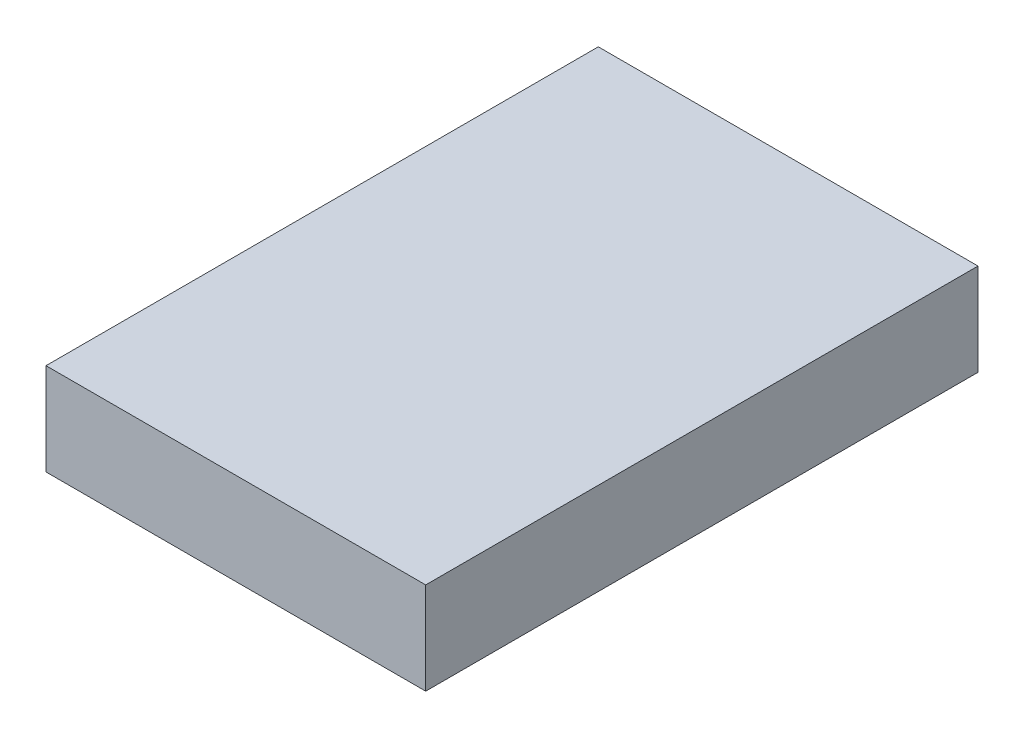
ISO-10303-21;
HEADER;
FILE_DESCRIPTION(('STEP AP214'),'2;1');
FILE_NAME('part.step','',(''),(''),'','','');
FILE_SCHEMA(('AUTOMOTIVE_DESIGN { 1 0 10303 214 1 1 1 1 }'));
ENDSEC;
DATA;
#1=APPLICATION_CONTEXT('core data for automotive mechanical design processes');
#2=APPLICATION_PROTOCOL_DEFINITION('international standard','automotive_design',2000,#1);
#3=PRODUCT_CONTEXT('',#1,'mechanical');
#4=PRODUCT('Part','Part','',(#3));
#5=PRODUCT_RELATED_PRODUCT_CATEGORY('part','',(#4));
#6=PRODUCT_DEFINITION_FORMATION('','',#4);
#7=PRODUCT_DEFINITION_CONTEXT('part definition',#1,'design');
#8=PRODUCT_DEFINITION('design','',#6,#7);
#9=PRODUCT_DEFINITION_SHAPE('','',#8);
#10=(LENGTH_UNIT() NAMED_UNIT(*) SI_UNIT(.MILLI.,.METRE.));
#11=(NAMED_UNIT(*) PLANE_ANGLE_UNIT() SI_UNIT($,.RADIAN.));
#12=(NAMED_UNIT(*) SI_UNIT($,.STERADIAN.) SOLID_ANGLE_UNIT());
#13=UNCERTAINTY_MEASURE_WITH_UNIT(LENGTH_MEASURE(1.E-05),#10,'distance_accuracy_value','');
#14=(GEOMETRIC_REPRESENTATION_CONTEXT(3) GLOBAL_UNCERTAINTY_ASSIGNED_CONTEXT((#13)) GLOBAL_UNIT_ASSIGNED_CONTEXT((#10,
#11,#12)) REPRESENTATION_CONTEXT('',''));
#15=CARTESIAN_POINT('',(0.,0.,0.));
#16=DIRECTION('',(0.,0.,1.));
#17=DIRECTION('',(1.,0.,0.));
#18=AXIS2_PLACEMENT_3D('',#15,#16,#17);
#19=CARTESIAN_POINT('',(8.24999999999999,4.,-12.));
#20=DIRECTION('',(-1.,0.,0.));
#21=DIRECTION('',(0.,0.,1.));
#22=AXIS2_PLACEMENT_3D('',#19,#20,#21);
#23=PLANE('',#22);
#24=DIRECTION('',(0.,0.,-1.));
#25=VECTOR('',#24,1.);
#26=CARTESIAN_POINT('',(8.24999999999999,0.,-12.));
#27=LINE('',#26,#25);
#28=CARTESIAN_POINT('',(8.25,0.,12.));
#29=VERTEX_POINT('',#28);
#30=CARTESIAN_POINT('',(8.24999999999999,0.,-12.));
#31=VERTEX_POINT('',#30);
#32=EDGE_CURVE('E97',#29,#31,#27,.T.);
#33=ORIENTED_EDGE('',*,*,#32,.T.);
#34=DIRECTION('',(0.,-1.,0.));
#35=VECTOR('',#34,1.);
#36=CARTESIAN_POINT('',(8.24999999999999,4.,-12.));
#37=LINE('',#36,#35);
#38=CARTESIAN_POINT('',(8.24999999999999,4.,-12.));
#39=VERTEX_POINT('',#38);
#40=EDGE_CURVE('E11',#39,#31,#37,.T.);
#41=ORIENTED_EDGE('',*,*,#40,.F.);
#42=DIRECTION('',(0.,0.,-1.));
#43=VECTOR('',#42,1.);
#44=CARTESIAN_POINT('',(8.24999999999999,4.,-12.));
#45=LINE('',#44,#43);
#46=CARTESIAN_POINT('',(8.25,4.,12.));
#47=VERTEX_POINT('',#46);
#48=EDGE_CURVE('E85',#47,#39,#45,.T.);
#49=ORIENTED_EDGE('',*,*,#48,.F.);
#50=DIRECTION('',(0.,-1.,0.));
#51=VECTOR('',#50,1.);
#52=CARTESIAN_POINT('',(8.25,4.,12.));
#53=LINE('',#52,#51);
#54=EDGE_CURVE('E93',#47,#29,#53,.T.);
#55=ORIENTED_EDGE('',*,*,#54,.T.);
#56=EDGE_LOOP('',(#33,#41,#49,#55));
#57=FACE_BOUND('',#56,.T.);
#58=ADVANCED_FACE('F34',(#57),#23,.F.);
#59=CARTESIAN_POINT('',(-8.25000000000001,4.,-12.));
#60=DIRECTION('',(0.,0.,1.));
#61=DIRECTION('',(1.,0.,0.));
#62=AXIS2_PLACEMENT_3D('',#59,#60,#61);
#63=PLANE('',#62);
#64=DIRECTION('',(-1.,0.,0.));
#65=VECTOR('',#64,1.);
#66=CARTESIAN_POINT('',(-8.25000000000001,0.,-12.));
#67=LINE('',#66,#65);
#68=CARTESIAN_POINT('',(-8.25000000000001,0.,-12.));
#69=VERTEX_POINT('',#68);
#70=EDGE_CURVE('E89',#31,#69,#67,.T.);
#71=ORIENTED_EDGE('',*,*,#70,.T.);
#72=DIRECTION('',(0.,-1.,0.));
#73=VECTOR('',#72,1.);
#74=CARTESIAN_POINT('',(-8.25000000000001,4.,-12.));
#75=LINE('',#74,#73);
#76=CARTESIAN_POINT('',(-8.25000000000001,4.,-12.));
#77=VERTEX_POINT('',#76);
#78=EDGE_CURVE('E42',#77,#69,#75,.T.);
#79=ORIENTED_EDGE('',*,*,#78,.F.);
#80=DIRECTION('',(-1.,0.,0.));
#81=VECTOR('',#80,1.);
#82=CARTESIAN_POINT('',(-8.25000000000001,4.,-12.));
#83=LINE('',#82,#81);
#84=EDGE_CURVE('E80',#39,#77,#83,.T.);
#85=ORIENTED_EDGE('',*,*,#84,.F.);
#86=ORIENTED_EDGE('',*,*,#40,.T.);
#87=EDGE_LOOP('',(#71,#79,#85,#86));
#88=FACE_BOUND('',#87,.T.);
#89=ADVANCED_FACE('F88',(#88),#63,.F.);
#90=CARTESIAN_POINT('',(-8.25000000000001,4.,-12.));
#91=DIRECTION('',(1.,0.,0.));
#92=DIRECTION('',(0.,0.,-1.));
#93=AXIS2_PLACEMENT_3D('',#90,#91,#92);
#94=PLANE('',#93);
#95=DIRECTION('',(0.,0.,1.));
#96=VECTOR('',#95,1.);
#97=CARTESIAN_POINT('',(-8.25000000000001,0.,-12.));
#98=LINE('',#97,#96);
#99=CARTESIAN_POINT('',(-8.25,0.,12.));
#100=VERTEX_POINT('',#99);
#101=EDGE_CURVE('E67',#69,#100,#98,.T.);
#102=ORIENTED_EDGE('',*,*,#101,.T.);
#103=DIRECTION('',(0.,-1.,0.));
#104=VECTOR('',#103,1.);
#105=CARTESIAN_POINT('',(-8.25,4.,12.));
#106=LINE('',#105,#104);
#107=CARTESIAN_POINT('',(-8.25,4.,12.));
#108=VERTEX_POINT('',#107);
#109=EDGE_CURVE('E90',#108,#100,#106,.T.);
#110=ORIENTED_EDGE('',*,*,#109,.F.);
#111=DIRECTION('',(0.,0.,1.));
#112=VECTOR('',#111,1.);
#113=CARTESIAN_POINT('',(-8.25000000000001,4.,-12.));
#114=LINE('',#113,#112);
#115=EDGE_CURVE('E83',#77,#108,#114,.T.);
#116=ORIENTED_EDGE('',*,*,#115,.F.);
#117=ORIENTED_EDGE('',*,*,#78,.T.);
#118=EDGE_LOOP('',(#102,#110,#116,#117));
#119=FACE_BOUND('',#118,.T.);
#120=ADVANCED_FACE('F91',(#119),#94,.F.);
#121=CARTESIAN_POINT('',(-8.25,4.,12.));
#122=DIRECTION('',(0.,0.,-1.));
#123=DIRECTION('',(-1.,0.,0.));
#124=AXIS2_PLACEMENT_3D('',#121,#122,#123);
#125=PLANE('',#124);
#126=DIRECTION('',(1.,0.,0.));
#127=VECTOR('',#126,1.);
#128=CARTESIAN_POINT('',(-8.25,0.,12.));
#129=LINE('',#128,#127);
#130=EDGE_CURVE('E73',#100,#29,#129,.T.);
#131=ORIENTED_EDGE('',*,*,#130,.T.);
#132=ORIENTED_EDGE('',*,*,#54,.F.);
#133=DIRECTION('',(1.,0.,0.));
#134=VECTOR('',#133,1.);
#135=CARTESIAN_POINT('',(-8.25,4.,12.));
#136=LINE('',#135,#134);
#137=EDGE_CURVE('E50',#108,#47,#136,.T.);
#138=ORIENTED_EDGE('',*,*,#137,.F.);
#139=ORIENTED_EDGE('',*,*,#109,.T.);
#140=EDGE_LOOP('',(#131,#132,#138,#139));
#141=FACE_BOUND('',#140,.T.);
#142=ADVANCED_FACE('F104',(#141),#125,.F.);
#143=CARTESIAN_POINT('',(0.,4.,0.));
#144=DIRECTION('',(0.,1.,0.));
#145=DIRECTION('',(0.,0.,1.));
#146=AXIS2_PLACEMENT_3D('',#143,#144,#145);
#147=PLANE('',#146);
#148=ORIENTED_EDGE('',*,*,#48,.T.);
#149=ORIENTED_EDGE('',*,*,#84,.T.);
#150=ORIENTED_EDGE('',*,*,#115,.T.);
#151=ORIENTED_EDGE('',*,*,#137,.T.);
#152=EDGE_LOOP('',(#148,#149,#150,#151));
#153=FACE_BOUND('',#152,.T.);
#154=ADVANCED_FACE('F81',(#153),#147,.T.);
#155=CARTESIAN_POINT('',(0.,0.,0.));
#156=DIRECTION('',(0.,1.,0.));
#157=DIRECTION('',(0.,0.,1.));
#158=AXIS2_PLACEMENT_3D('',#155,#156,#157);
#159=PLANE('',#158);
#160=ORIENTED_EDGE('',*,*,#32,.F.);
#161=ORIENTED_EDGE('',*,*,#130,.F.);
#162=ORIENTED_EDGE('',*,*,#101,.F.);
#163=ORIENTED_EDGE('',*,*,#70,.F.);
#164=EDGE_LOOP('',(#160,#161,#162,#163));
#165=FACE_BOUND('',#164,.T.);
#166=ADVANCED_FACE('F107',(#165),#159,.F.);
#167=CLOSED_SHELL('',(#58,#89,#120,#142,#154,#166));
#168=MANIFOLD_SOLID_BREP('B2',#167);
#169=ADVANCED_BREP_SHAPE_REPRESENTATION('',(#18,#168),#14);
#170=SHAPE_DEFINITION_REPRESENTATION(#9,#169);
ENDSEC;
END-ISO-10303-21;
